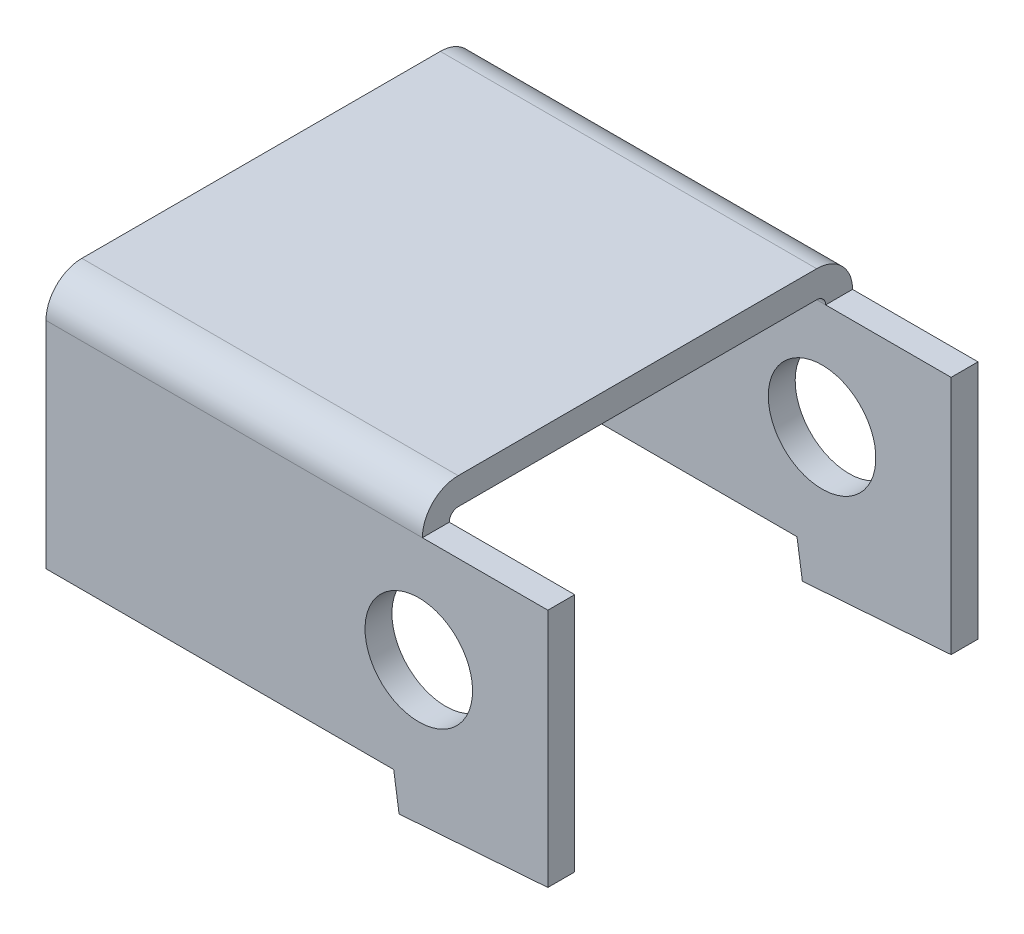
ISO-10303-21;
HEADER;
FILE_DESCRIPTION(('STEP AP214'),'2;1');
FILE_NAME('part.step','',(''),(''),'','','');
FILE_SCHEMA(('AUTOMOTIVE_DESIGN { 1 0 10303 214 1 1 1 1 }'));
ENDSEC;
DATA;
#1=APPLICATION_CONTEXT('core data for automotive mechanical design processes');
#2=APPLICATION_PROTOCOL_DEFINITION('international standard','automotive_design',2000,#1);
#3=PRODUCT_CONTEXT('',#1,'mechanical');
#4=PRODUCT('Part','Part','',(#3));
#5=PRODUCT_RELATED_PRODUCT_CATEGORY('part','',(#4));
#6=PRODUCT_DEFINITION_FORMATION('','',#4);
#7=PRODUCT_DEFINITION_CONTEXT('part definition',#1,'design');
#8=PRODUCT_DEFINITION('design','',#6,#7);
#9=PRODUCT_DEFINITION_SHAPE('','',#8);
#10=(LENGTH_UNIT() NAMED_UNIT(*) SI_UNIT(.MILLI.,.METRE.));
#11=(NAMED_UNIT(*) PLANE_ANGLE_UNIT() SI_UNIT($,.RADIAN.));
#12=(NAMED_UNIT(*) SI_UNIT($,.STERADIAN.) SOLID_ANGLE_UNIT());
#13=UNCERTAINTY_MEASURE_WITH_UNIT(LENGTH_MEASURE(1.E-05),#10,'distance_accuracy_value','');
#14=(GEOMETRIC_REPRESENTATION_CONTEXT(3) GLOBAL_UNCERTAINTY_ASSIGNED_CONTEXT((#13)) GLOBAL_UNIT_ASSIGNED_CONTEXT((#10,
#11,#12)) REPRESENTATION_CONTEXT('',''));
#15=CARTESIAN_POINT('',(0.,0.,0.));
#16=DIRECTION('',(0.,0.,1.));
#17=DIRECTION('',(1.,0.,0.));
#18=AXIS2_PLACEMENT_3D('',#15,#16,#17);
#19=CARTESIAN_POINT('',(3.6,-3.7,6.));
#20=DIRECTION('',(-1.,0.,0.));
#21=DIRECTION('',(0.,0.,1.));
#22=AXIS2_PLACEMENT_3D('',#19,#20,#21);
#23=PLANE('',#22);
#24=DIRECTION('',(0.,1.,0.));
#25=VECTOR('',#24,1.);
#26=CARTESIAN_POINT('',(3.6,-3.7,-6.));
#27=LINE('',#26,#25);
#28=CARTESIAN_POINT('',(3.6,-3.7,-6.));
#29=VERTEX_POINT('',#28);
#30=CARTESIAN_POINT('',(3.600006,3.,-6.));
#31=VERTEX_POINT('',#30);
#32=EDGE_CURVE('E209',#29,#31,#27,.T.);
#33=ORIENTED_EDGE('',*,*,#32,.T.);
#34=DIRECTION('',(0.,0.,1.));
#35=VECTOR('',#34,1.);
#36=CARTESIAN_POINT('',(3.6,3.,6.));
#37=LINE('',#36,#35);
#38=CARTESIAN_POINT('',(3.6,3.,-5.25));
#39=VERTEX_POINT('',#38);
#40=EDGE_CURVE('E280',#31,#39,#37,.T.);
#41=ORIENTED_EDGE('',*,*,#40,.T.);
#42=DIRECTION('',(0.,1.,0.));
#43=VECTOR('',#42,1.);
#44=CARTESIAN_POINT('',(3.6,-4.,-5.25));
#45=LINE('',#44,#43);
#46=CARTESIAN_POINT('',(3.6,-3.7,-5.25));
#47=VERTEX_POINT('',#46);
#48=EDGE_CURVE('E294',#47,#39,#45,.T.);
#49=ORIENTED_EDGE('',*,*,#48,.F.);
#50=DIRECTION('',(0.,0.,-1.));
#51=VECTOR('',#50,1.);
#52=CARTESIAN_POINT('',(3.6,-3.7,6.));
#53=LINE('',#52,#51);
#54=EDGE_CURVE('E238',#47,#29,#53,.T.);
#55=ORIENTED_EDGE('',*,*,#54,.T.);
#56=EDGE_LOOP('',(#33,#41,#49,#55));
#57=FACE_BOUND('',#56,.T.);
#58=ADVANCED_FACE('F39',(#57),#23,.F.);
#59=CARTESIAN_POINT('',(-10.4,4.,6.));
#60=DIRECTION('',(0.,-1.,0.));
#61=DIRECTION('',(0.,0.,-1.));
#62=AXIS2_PLACEMENT_3D('',#59,#60,#61);
#63=PLANE('',#62);
#64=DIRECTION('',(0.,0.,1.));
#65=VECTOR('',#64,1.);
#66=CARTESIAN_POINT('',(0.0999999999999998,4.,5.));
#67=LINE('',#66,#65);
#68=CARTESIAN_POINT('',(0.0999999999999998,4.,-5.));
#69=VERTEX_POINT('',#68);
#70=CARTESIAN_POINT('',(0.0999999999999998,4.,5.));
#71=VERTEX_POINT('',#70);
#72=EDGE_CURVE('E166',#69,#71,#67,.T.);
#73=ORIENTED_EDGE('',*,*,#72,.F.);
#74=DIRECTION('',(-1.,0.,0.));
#75=VECTOR('',#74,1.);
#76=CARTESIAN_POINT('',(-10.4,4.,-5.));
#77=LINE('',#76,#75);
#78=CARTESIAN_POINT('',(-10.4,4.,-5.));
#79=VERTEX_POINT('',#78);
#80=EDGE_CURVE('E180',#69,#79,#77,.T.);
#81=ORIENTED_EDGE('',*,*,#80,.T.);
#82=DIRECTION('',(0.,0.,-1.));
#83=VECTOR('',#82,1.);
#84=CARTESIAN_POINT('',(-10.4,4.,6.));
#85=LINE('',#84,#83);
#86=CARTESIAN_POINT('',(-10.4,4.,5.));
#87=VERTEX_POINT('',#86);
#88=EDGE_CURVE('E192',#87,#79,#85,.T.);
#89=ORIENTED_EDGE('',*,*,#88,.F.);
#90=DIRECTION('',(-1.,0.,0.));
#91=VECTOR('',#90,1.);
#92=CARTESIAN_POINT('',(-10.4,4.,5.));
#93=LINE('',#92,#91);
#94=EDGE_CURVE('E183',#87,#71,#93,.F.);
#95=ORIENTED_EDGE('',*,*,#94,.T.);
#96=EDGE_LOOP('',(#73,#81,#89,#95));
#97=FACE_BOUND('',#96,.T.);
#98=ADVANCED_FACE('F178',(#97),#63,.F.);
#99=CARTESIAN_POINT('',(-10.4,3.,-5.));
#100=DIRECTION('',(1.,0.,0.));
#101=DIRECTION('',(0.,0.,-1.));
#102=AXIS2_PLACEMENT_3D('',#99,#100,#101);
#103=CYLINDRICAL_SURFACE('',#102,1.);
#104=ORIENTED_EDGE('',*,*,#80,.F.);
#105=CARTESIAN_POINT('',(0.0999999999999998,3.,-5.));
#106=DIRECTION('',(1.,0.,0.));
#107=DIRECTION('',(0.,0.,-1.));
#108=AXIS2_PLACEMENT_3D('',#105,#106,#107);
#109=CIRCLE('',#108,1.);
#110=CARTESIAN_POINT('',(0.0999999999999998,3.,-6.));
#111=VERTEX_POINT('',#110);
#112=EDGE_CURVE('E163',#111,#69,#109,.T.);
#113=ORIENTED_EDGE('',*,*,#112,.F.);
#114=DIRECTION('',(-1.,0.,0.));
#115=VECTOR('',#114,1.);
#116=CARTESIAN_POINT('',(3.6,3.,-6.));
#117=LINE('',#116,#115);
#118=CARTESIAN_POINT('',(-10.4,3.,-6.));
#119=VERTEX_POINT('',#118);
#120=EDGE_CURVE('E197',#119,#111,#117,.F.);
#121=ORIENTED_EDGE('',*,*,#120,.F.);
#122=CARTESIAN_POINT('',(-10.4,3.,-5.));
#123=DIRECTION('',(1.,0.,0.));
#124=DIRECTION('',(0.,0.,-1.));
#125=AXIS2_PLACEMENT_3D('',#122,#123,#124);
#126=CIRCLE('',#125,1.);
#127=EDGE_CURVE('E187',#79,#119,#126,.F.);
#128=ORIENTED_EDGE('',*,*,#127,.F.);
#129=EDGE_LOOP('',(#104,#113,#121,#128));
#130=FACE_BOUND('',#129,.T.);
#131=ADVANCED_FACE('F186',(#130),#103,.T.);
#132=CARTESIAN_POINT('',(0.,3.,5.));
#133=DIRECTION('',(-1.,0.,0.));
#134=DIRECTION('',(0.,0.,1.));
#135=AXIS2_PLACEMENT_3D('',#132,#133,#134);
#136=CYLINDRICAL_SURFACE('',#135,1.);
#137=DIRECTION('',(-1.,0.,0.));
#138=VECTOR('',#137,1.);
#139=CARTESIAN_POINT('',(0.,3.,6.));
#140=LINE('',#139,#138);
#141=CARTESIAN_POINT('',(0.0999999999999998,3.,6.));
#142=VERTEX_POINT('',#141);
#143=CARTESIAN_POINT('',(-10.4,3.,6.));
#144=VERTEX_POINT('',#143);
#145=EDGE_CURVE('E199',#142,#144,#140,.T.);
#146=ORIENTED_EDGE('',*,*,#145,.F.);
#147=CARTESIAN_POINT('',(0.0999999999999998,3.,5.));
#148=DIRECTION('',(1.,0.,0.));
#149=DIRECTION('',(0.,0.,-1.));
#150=AXIS2_PLACEMENT_3D('',#147,#148,#149);
#151=CIRCLE('',#150,1.);
#152=EDGE_CURVE('E184',#71,#142,#151,.T.);
#153=ORIENTED_EDGE('',*,*,#152,.F.);
#154=ORIENTED_EDGE('',*,*,#94,.F.);
#155=CARTESIAN_POINT('',(-10.4,3.,5.));
#156=DIRECTION('',(1.,0.,0.));
#157=DIRECTION('',(0.,0.,-1.));
#158=AXIS2_PLACEMENT_3D('',#155,#156,#157);
#159=CIRCLE('',#158,1.);
#160=EDGE_CURVE('E189',#144,#87,#159,.F.);
#161=ORIENTED_EDGE('',*,*,#160,.F.);
#162=EDGE_LOOP('',(#146,#153,#154,#161));
#163=FACE_BOUND('',#162,.T.);
#164=ADVANCED_FACE('F41',(#163),#136,.T.);
#165=CARTESIAN_POINT('',(-10.4,3.,5.));
#166=DIRECTION('',(1.,0.,0.));
#167=DIRECTION('',(0.,0.,-1.));
#168=AXIS2_PLACEMENT_3D('',#165,#166,#167);
#169=CYLINDRICAL_SURFACE('',#168,0.25);
#170=CARTESIAN_POINT('',(0.0999999999999994,3.,5.));
#171=DIRECTION('',(1.,0.,0.));
#172=DIRECTION('',(0.,0.,-1.));
#173=AXIS2_PLACEMENT_3D('',#170,#171,#172);
#174=CIRCLE('',#173,0.25);
#175=CARTESIAN_POINT('',(0.0999999999999994,3.,5.25));
#176=VERTEX_POINT('',#175);
#177=CARTESIAN_POINT('',(0.0999999999999994,3.25,5.));
#178=VERTEX_POINT('',#177);
#179=EDGE_CURVE('E278',#176,#178,#174,.F.);
#180=ORIENTED_EDGE('',*,*,#179,.F.);
#181=DIRECTION('',(1.,0.,0.));
#182=VECTOR('',#181,1.);
#183=CARTESIAN_POINT('',(-10.4,3.,5.25));
#184=LINE('',#183,#182);
#185=CARTESIAN_POINT('',(-10.4,3.,5.25));
#186=VERTEX_POINT('',#185);
#187=EDGE_CURVE('E314',#186,#176,#184,.T.);
#188=ORIENTED_EDGE('',*,*,#187,.F.);
#189=CARTESIAN_POINT('',(-10.4,3.,5.));
#190=DIRECTION('',(1.,0.,0.));
#191=DIRECTION('',(0.,0.,-1.));
#192=AXIS2_PLACEMENT_3D('',#189,#190,#191);
#193=CIRCLE('',#192,0.25);
#194=CARTESIAN_POINT('',(-10.4,3.25,5.));
#195=VERTEX_POINT('',#194);
#196=EDGE_CURVE('E308',#195,#186,#193,.T.);
#197=ORIENTED_EDGE('',*,*,#196,.F.);
#198=DIRECTION('',(1.,0.,0.));
#199=VECTOR('',#198,1.);
#200=CARTESIAN_POINT('',(-10.4,3.25,5.));
#201=LINE('',#200,#199);
#202=EDGE_CURVE('E317',#195,#178,#201,.T.);
#203=ORIENTED_EDGE('',*,*,#202,.T.);
#204=EDGE_LOOP('',(#180,#188,#197,#203));
#205=FACE_BOUND('',#204,.T.);
#206=ADVANCED_FACE('F361',(#205),#169,.F.);
#207=CARTESIAN_POINT('',(-10.4,3.25,-5.));
#208=DIRECTION('',(0.,1.,0.));
#209=DIRECTION('',(0.,0.,1.));
#210=AXIS2_PLACEMENT_3D('',#207,#208,#209);
#211=PLANE('',#210);
#212=DIRECTION('',(0.,0.,-1.));
#213=VECTOR('',#212,1.);
#214=CARTESIAN_POINT('',(0.0999999999999994,3.25,-5.));
#215=LINE('',#214,#213);
#216=CARTESIAN_POINT('',(0.0999999999999994,3.25,-5.));
#217=VERTEX_POINT('',#216);
#218=EDGE_CURVE('E55',#178,#217,#215,.T.);
#219=ORIENTED_EDGE('',*,*,#218,.F.);
#220=ORIENTED_EDGE('',*,*,#202,.F.);
#221=DIRECTION('',(0.,0.,1.));
#222=VECTOR('',#221,1.);
#223=CARTESIAN_POINT('',(-10.4,3.25,-5.));
#224=LINE('',#223,#222);
#225=CARTESIAN_POINT('',(-10.4,3.25,-5.));
#226=VERTEX_POINT('',#225);
#227=EDGE_CURVE('E305',#226,#195,#224,.T.);
#228=ORIENTED_EDGE('',*,*,#227,.F.);
#229=DIRECTION('',(1.,0.,0.));
#230=VECTOR('',#229,1.);
#231=CARTESIAN_POINT('',(-10.4,3.25,-5.));
#232=LINE('',#231,#230);
#233=EDGE_CURVE('E320',#226,#217,#232,.T.);
#234=ORIENTED_EDGE('',*,*,#233,.T.);
#235=EDGE_LOOP('',(#219,#220,#228,#234));
#236=FACE_BOUND('',#235,.T.);
#237=ADVANCED_FACE('F363',(#236),#211,.F.);
#238=CARTESIAN_POINT('',(-10.4,3.,-5.));
#239=DIRECTION('',(1.,0.,0.));
#240=DIRECTION('',(0.,0.,-1.));
#241=AXIS2_PLACEMENT_3D('',#238,#239,#240);
#242=CYLINDRICAL_SURFACE('',#241,0.25);
#243=CARTESIAN_POINT('',(0.0999999999999994,3.,-5.));
#244=DIRECTION('',(1.,0.,0.));
#245=DIRECTION('',(0.,0.,-1.));
#246=AXIS2_PLACEMENT_3D('',#243,#244,#245);
#247=CIRCLE('',#246,0.25);
#248=CARTESIAN_POINT('',(0.0999999999999994,3.,-5.25));
#249=VERTEX_POINT('',#248);
#250=EDGE_CURVE('E11',#217,#249,#247,.F.);
#251=ORIENTED_EDGE('',*,*,#250,.F.);
#252=ORIENTED_EDGE('',*,*,#233,.F.);
#253=CARTESIAN_POINT('',(-10.4,3.,-5.));
#254=DIRECTION('',(1.,0.,0.));
#255=DIRECTION('',(0.,0.,-1.));
#256=AXIS2_PLACEMENT_3D('',#253,#254,#255);
#257=CIRCLE('',#256,0.25);
#258=CARTESIAN_POINT('',(-10.4,3.,-5.25));
#259=VERTEX_POINT('',#258);
#260=EDGE_CURVE('E302',#259,#226,#257,.T.);
#261=ORIENTED_EDGE('',*,*,#260,.F.);
#262=DIRECTION('',(1.,0.,0.));
#263=VECTOR('',#262,1.);
#264=CARTESIAN_POINT('',(-10.4,3.,-5.25));
#265=LINE('',#264,#263);
#266=EDGE_CURVE('E323',#259,#249,#265,.T.);
#267=ORIENTED_EDGE('',*,*,#266,.T.);
#268=EDGE_LOOP('',(#251,#252,#261,#267));
#269=FACE_BOUND('',#268,.T.);
#270=ADVANCED_FACE('F367',(#269),#242,.F.);
#271=CARTESIAN_POINT('',(-10.4,-3.,6.));
#272=DIRECTION('',(0.,1.,0.));
#273=DIRECTION('',(0.,0.,1.));
#274=AXIS2_PLACEMENT_3D('',#271,#272,#273);
#275=PLANE('',#274);
#276=DIRECTION('',(0.,0.,-1.));
#277=VECTOR('',#276,1.);
#278=CARTESIAN_POINT('',(-10.4,-3.,6.));
#279=LINE('',#278,#277);
#280=CARTESIAN_POINT('',(-10.4,-3.,6.));
#281=VERTEX_POINT('',#280);
#282=CARTESIAN_POINT('',(-10.4,-3.,5.25));
#283=VERTEX_POINT('',#282);
#284=EDGE_CURVE('E260',#281,#283,#279,.T.);
#285=ORIENTED_EDGE('',*,*,#284,.T.);
#286=DIRECTION('',(1.,0.,0.));
#287=VECTOR('',#286,1.);
#288=CARTESIAN_POINT('',(-10.4,-3.,5.25));
#289=LINE('',#288,#287);
#290=CARTESIAN_POINT('',(-0.7,-3.,5.25));
#291=VERTEX_POINT('',#290);
#292=EDGE_CURVE('E225',#283,#291,#289,.T.);
#293=ORIENTED_EDGE('',*,*,#292,.T.);
#294=DIRECTION('',(0.,0.,-1.));
#295=VECTOR('',#294,1.);
#296=CARTESIAN_POINT('',(-0.7,-3.,6.));
#297=LINE('',#296,#295);
#298=CARTESIAN_POINT('',(-0.7,-3.,6.));
#299=VERTEX_POINT('',#298);
#300=EDGE_CURVE('E256',#299,#291,#297,.T.);
#301=ORIENTED_EDGE('',*,*,#300,.F.);
#302=DIRECTION('',(1.,0.,0.));
#303=VECTOR('',#302,1.);
#304=CARTESIAN_POINT('',(-10.4,-3.,6.));
#305=LINE('',#304,#303);
#306=EDGE_CURVE('E232',#281,#299,#305,.T.);
#307=ORIENTED_EDGE('',*,*,#306,.F.);
#308=EDGE_LOOP('',(#285,#293,#301,#307));
#309=FACE_BOUND('',#308,.T.);
#310=ADVANCED_FACE('F342',(#309),#275,.F.);
#311=CARTESIAN_POINT('',(-0.7,-3.,6.));
#312=DIRECTION('',(0.988936352868297,0.148340452930245,0.));
#313=DIRECTION('',(-0.148340452930245,0.988936352868298,0.));
#314=AXIS2_PLACEMENT_3D('',#311,#312,#313);
#315=PLANE('',#314);
#316=ORIENTED_EDGE('',*,*,#300,.T.);
#317=DIRECTION('',(0.148340452930245,-0.988936352868298,0.));
#318=VECTOR('',#317,1.);
#319=CARTESIAN_POINT('',(-0.7,-3.,5.25));
#320=LINE('',#319,#318);
#321=CARTESIAN_POINT('',(-0.55000000000023,-4.00000000000001,5.25));
#322=VERTEX_POINT('',#321);
#323=EDGE_CURVE('E335',#291,#322,#320,.T.);
#324=ORIENTED_EDGE('',*,*,#323,.T.);
#325=DIRECTION('',(0.,0.,-1.));
#326=VECTOR('',#325,1.);
#327=CARTESIAN_POINT('',(-0.55,-4.,6.));
#328=LINE('',#327,#326);
#329=CARTESIAN_POINT('',(-0.55,-4.,6.));
#330=VERTEX_POINT('',#329);
#331=EDGE_CURVE('E252',#330,#322,#328,.T.);
#332=ORIENTED_EDGE('',*,*,#331,.F.);
#333=DIRECTION('',(0.148340452930245,-0.988936352868298,0.));
#334=VECTOR('',#333,1.);
#335=CARTESIAN_POINT('',(-0.7,-3.,6.));
#336=LINE('',#335,#334);
#337=EDGE_CURVE('E235',#299,#330,#336,.T.);
#338=ORIENTED_EDGE('',*,*,#337,.F.);
#339=EDGE_LOOP('',(#316,#324,#332,#338));
#340=FACE_BOUND('',#339,.T.);
#341=ADVANCED_FACE('F348',(#340),#315,.F.);
#342=CARTESIAN_POINT('',(-0.55,-4.,6.));
#343=DIRECTION('',(-0.0721010121751331,0.997397335089342,0.));
#344=DIRECTION('',(-0.997397335089342,-0.0721010121751332,0.));
#345=AXIS2_PLACEMENT_3D('',#342,#343,#344);
#346=PLANE('',#345);
#347=ORIENTED_EDGE('',*,*,#331,.T.);
#348=DIRECTION('',(0.997397335089342,0.0721010121751332,0.));
#349=VECTOR('',#348,1.);
#350=CARTESIAN_POINT('',(-0.55,-4.,5.25));
#351=LINE('',#350,#349);
#352=CARTESIAN_POINT('',(3.6,-3.7,5.25));
#353=VERTEX_POINT('',#352);
#354=EDGE_CURVE('E333',#322,#353,#351,.T.);
#355=ORIENTED_EDGE('',*,*,#354,.T.);
#356=CARTESIAN_POINT('',(3.6,-3.7,6.));
#357=VERTEX_POINT('',#356);
#358=EDGE_CURVE('E248',#357,#353,#53,.T.);
#359=ORIENTED_EDGE('',*,*,#358,.F.);
#360=DIRECTION('',(0.997397335089342,0.0721010121751332,0.));
#361=VECTOR('',#360,1.);
#362=CARTESIAN_POINT('',(-0.55,-4.,6.));
#363=LINE('',#362,#361);
#364=EDGE_CURVE('E237',#330,#357,#363,.T.);
#365=ORIENTED_EDGE('',*,*,#364,.F.);
#366=EDGE_LOOP('',(#347,#355,#359,#365));
#367=FACE_BOUND('',#366,.T.);
#368=ADVANCED_FACE('F397',(#367),#346,.F.);
#369=CARTESIAN_POINT('',(0.,0.,6.));
#370=DIRECTION('',(0.,0.,-1.));
#371=DIRECTION('',(-1.,0.,0.));
#372=AXIS2_PLACEMENT_3D('',#369,#370,#371);
#373=CYLINDRICAL_SURFACE('',#372,1.5);
#374=CARTESIAN_POINT('',(0.,0.,5.25));
#375=DIRECTION('',(0.,0.,1.));
#376=DIRECTION('',(0.,-1.,0.));
#377=AXIS2_PLACEMENT_3D('',#374,#375,#376);
#378=CIRCLE('',#377,1.5);
#379=CARTESIAN_POINT('',(0.,-1.5,5.25));
#380=VERTEX_POINT('',#379);
#381=EDGE_CURVE('E332',#380,#380,#378,.T.);
#382=ORIENTED_EDGE('',*,*,#381,.F.);
#383=EDGE_LOOP('',(#382));
#384=FACE_BOUND('',#383,.T.);
#385=CARTESIAN_POINT('',(0.,0.,6.));
#386=DIRECTION('',(0.,0.,1.));
#387=DIRECTION('',(1.,0.,0.));
#388=AXIS2_PLACEMENT_3D('',#385,#386,#387);
#389=CIRCLE('',#388,1.5);
#390=CARTESIAN_POINT('',(1.5,0.,6.));
#391=VERTEX_POINT('',#390);
#392=EDGE_CURVE('E212',#391,#391,#389,.T.);
#393=ORIENTED_EDGE('',*,*,#392,.T.);
#394=EDGE_LOOP('',(#393));
#395=FACE_BOUND('',#394,.T.);
#396=ADVANCED_FACE('F423',(#384,#395),#373,.F.);
#397=CARTESIAN_POINT('',(0.,0.,6.));
#398=DIRECTION('',(0.,0.,-1.));
#399=DIRECTION('',(-1.,0.,0.));
#400=AXIS2_PLACEMENT_3D('',#397,#398,#399);
#401=PLANE('',#400);
#402=DIRECTION('',(0.,1.,0.));
#403=VECTOR('',#402,1.);
#404=CARTESIAN_POINT('',(3.6,-3.7,6.));
#405=LINE('',#404,#403);
#406=CARTESIAN_POINT('',(3.600006,3.,6.));
#407=VERTEX_POINT('',#406);
#408=EDGE_CURVE('E233',#357,#407,#405,.T.);
#409=ORIENTED_EDGE('',*,*,#408,.T.);
#410=EDGE_CURVE('E48',#407,#142,#140,.T.);
#411=ORIENTED_EDGE('',*,*,#410,.T.);
#412=ORIENTED_EDGE('',*,*,#145,.T.);
#413=DIRECTION('',(0.,-1.,0.));
#414=VECTOR('',#413,1.);
#415=CARTESIAN_POINT('',(-10.4,-3.,6.));
#416=LINE('',#415,#414);
#417=EDGE_CURVE('E230',#144,#281,#416,.T.);
#418=ORIENTED_EDGE('',*,*,#417,.T.);
#419=ORIENTED_EDGE('',*,*,#306,.T.);
#420=ORIENTED_EDGE('',*,*,#337,.T.);
#421=ORIENTED_EDGE('',*,*,#364,.T.);
#422=EDGE_LOOP('',(#409,#411,#412,#418,#419,#420,#421));
#423=FACE_BOUND('',#422,.T.);
#424=ORIENTED_EDGE('',*,*,#392,.F.);
#425=EDGE_LOOP('',(#424));
#426=FACE_BOUND('',#425,.T.);
#427=ADVANCED_FACE('F352',(#423,#426),#401,.F.);
#428=CARTESIAN_POINT('',(0.,0.,-6.));
#429=DIRECTION('',(0.,0.,-1.));
#430=DIRECTION('',(-1.,0.,0.));
#431=AXIS2_PLACEMENT_3D('',#428,#429,#430);
#432=PLANE('',#431);
#433=DIRECTION('',(0.,-1.,0.));
#434=VECTOR('',#433,1.);
#435=CARTESIAN_POINT('',(-10.4,-3.,-6.));
#436=LINE('',#435,#434);
#437=CARTESIAN_POINT('',(-10.4,-3.,-6.));
#438=VERTEX_POINT('',#437);
#439=EDGE_CURVE('E211',#119,#438,#436,.T.);
#440=ORIENTED_EDGE('',*,*,#439,.F.);
#441=ORIENTED_EDGE('',*,*,#120,.T.);
#442=DIRECTION('',(1.,0.,0.));
#443=VECTOR('',#442,1.);
#444=CARTESIAN_POINT('',(0.0999999999999998,3.,-6.));
#445=LINE('',#444,#443);
#446=EDGE_CURVE('E276',#111,#31,#445,.T.);
#447=ORIENTED_EDGE('',*,*,#446,.T.);
#448=ORIENTED_EDGE('',*,*,#32,.F.);
#449=DIRECTION('',(0.997397335089342,0.0721010121751332,0.));
#450=VECTOR('',#449,1.);
#451=CARTESIAN_POINT('',(-0.55,-4.,-6.));
#452=LINE('',#451,#450);
#453=CARTESIAN_POINT('',(-0.55,-4.,-6.));
#454=VERTEX_POINT('',#453);
#455=EDGE_CURVE('E245',#454,#29,#452,.T.);
#456=ORIENTED_EDGE('',*,*,#455,.F.);
#457=DIRECTION('',(0.148340452930245,-0.988936352868298,0.));
#458=VECTOR('',#457,1.);
#459=CARTESIAN_POINT('',(-0.7,-3.,-6.));
#460=LINE('',#459,#458);
#461=CARTESIAN_POINT('',(-0.7,-3.,-6.));
#462=VERTEX_POINT('',#461);
#463=EDGE_CURVE('E242',#462,#454,#460,.T.);
#464=ORIENTED_EDGE('',*,*,#463,.F.);
#465=DIRECTION('',(1.,0.,0.));
#466=VECTOR('',#465,1.);
#467=CARTESIAN_POINT('',(-10.4,-3.,-6.));
#468=LINE('',#467,#466);
#469=EDGE_CURVE('E217',#438,#462,#468,.T.);
#470=ORIENTED_EDGE('',*,*,#469,.F.);
#471=EDGE_LOOP('',(#440,#441,#447,#448,#456,#464,#470));
#472=FACE_BOUND('',#471,.T.);
#473=CARTESIAN_POINT('',(0.,0.,-6.));
#474=DIRECTION('',(0.,0.,1.));
#475=DIRECTION('',(1.,0.,0.));
#476=AXIS2_PLACEMENT_3D('',#473,#474,#475);
#477=CIRCLE('',#476,1.5);
#478=CARTESIAN_POINT('',(1.5,0.,-6.));
#479=VERTEX_POINT('',#478);
#480=EDGE_CURVE('E220',#479,#479,#477,.T.);
#481=ORIENTED_EDGE('',*,*,#480,.T.);
#482=EDGE_LOOP('',(#481));
#483=FACE_BOUND('',#482,.T.);
#484=ADVANCED_FACE('F380',(#472,#483),#432,.T.);
#485=DIRECTION('',(0.,-1.,0.));
#486=VECTOR('',#485,1.);
#487=CARTESIAN_POINT('',(3.6,3.,5.25));
#488=LINE('',#487,#486);
#489=CARTESIAN_POINT('',(3.6,3.,5.25));
#490=VERTEX_POINT('',#489);
#491=EDGE_CURVE('E297',#490,#353,#488,.T.);
#492=ORIENTED_EDGE('',*,*,#491,.F.);
#493=EDGE_CURVE('E291',#490,#407,#37,.T.);
#494=ORIENTED_EDGE('',*,*,#493,.T.);
#495=ORIENTED_EDGE('',*,*,#408,.F.);
#496=ORIENTED_EDGE('',*,*,#358,.T.);
#497=EDGE_LOOP('',(#492,#494,#495,#496));
#498=FACE_BOUND('',#497,.T.);
#499=ADVANCED_FACE('F402',(#498),#23,.F.);
#500=CARTESIAN_POINT('',(-10.4,-3.,6.));
#501=DIRECTION('',(1.,0.,0.));
#502=DIRECTION('',(0.,0.,-1.));
#503=AXIS2_PLACEMENT_3D('',#500,#501,#502);
#504=PLANE('',#503);
#505=ORIENTED_EDGE('',*,*,#196,.T.);
#506=DIRECTION('',(0.,-1.,0.));
#507=VECTOR('',#506,1.);
#508=CARTESIAN_POINT('',(-10.4,3.,5.25));
#509=LINE('',#508,#507);
#510=EDGE_CURVE('E310',#186,#283,#509,.T.);
#511=ORIENTED_EDGE('',*,*,#510,.T.);
#512=ORIENTED_EDGE('',*,*,#284,.F.);
#513=ORIENTED_EDGE('',*,*,#417,.F.);
#514=ORIENTED_EDGE('',*,*,#160,.T.);
#515=ORIENTED_EDGE('',*,*,#88,.T.);
#516=ORIENTED_EDGE('',*,*,#127,.T.);
#517=ORIENTED_EDGE('',*,*,#439,.T.);
#518=CARTESIAN_POINT('',(-10.4,-3.,-5.25));
#519=VERTEX_POINT('',#518);
#520=EDGE_CURVE('E259',#519,#438,#279,.T.);
#521=ORIENTED_EDGE('',*,*,#520,.F.);
#522=DIRECTION('',(0.,1.,0.));
#523=VECTOR('',#522,1.);
#524=CARTESIAN_POINT('',(-10.4,-4.,-5.25));
#525=LINE('',#524,#523);
#526=EDGE_CURVE('E299',#519,#259,#525,.T.);
#527=ORIENTED_EDGE('',*,*,#526,.T.);
#528=ORIENTED_EDGE('',*,*,#260,.T.);
#529=ORIENTED_EDGE('',*,*,#227,.T.);
#530=EDGE_LOOP('',(#505,#511,#512,#513,#514,#515,#516,#517,#521,#527,#528,#529));
#531=FACE_BOUND('',#530,.T.);
#532=ADVANCED_FACE('F264',(#531),#504,.F.);
#533=CARTESIAN_POINT('',(-0.7,-3.,-5.25));
#534=VERTEX_POINT('',#533);
#535=EDGE_CURVE('E255',#534,#462,#297,.T.);
#536=ORIENTED_EDGE('',*,*,#535,.F.);
#537=DIRECTION('',(-1.,0.,0.));
#538=VECTOR('',#537,1.);
#539=CARTESIAN_POINT('',(-10.4,-3.,-5.25));
#540=LINE('',#539,#538);
#541=EDGE_CURVE('E329',#534,#519,#540,.T.);
#542=ORIENTED_EDGE('',*,*,#541,.T.);
#543=ORIENTED_EDGE('',*,*,#520,.T.);
#544=ORIENTED_EDGE('',*,*,#469,.T.);
#545=EDGE_LOOP('',(#536,#542,#543,#544));
#546=FACE_BOUND('',#545,.T.);
#547=ADVANCED_FACE('F386',(#546),#275,.F.);
#548=CARTESIAN_POINT('',(-0.55,-4.,-5.25));
#549=VERTEX_POINT('',#548);
#550=EDGE_CURVE('E251',#549,#454,#328,.T.);
#551=ORIENTED_EDGE('',*,*,#550,.F.);
#552=DIRECTION('',(-0.148340452930245,0.988936352868298,0.));
#553=VECTOR('',#552,1.);
#554=CARTESIAN_POINT('',(-0.7,-3.,-5.25));
#555=LINE('',#554,#553);
#556=EDGE_CURVE('E63',#549,#534,#555,.T.);
#557=ORIENTED_EDGE('',*,*,#556,.T.);
#558=ORIENTED_EDGE('',*,*,#535,.T.);
#559=ORIENTED_EDGE('',*,*,#463,.T.);
#560=EDGE_LOOP('',(#551,#557,#558,#559));
#561=FACE_BOUND('',#560,.T.);
#562=ADVANCED_FACE('F388',(#561),#315,.F.);
#563=ORIENTED_EDGE('',*,*,#54,.F.);
#564=DIRECTION('',(-0.997397335089342,-0.0721010121751332,0.));
#565=VECTOR('',#564,1.);
#566=CARTESIAN_POINT('',(-0.55,-4.,-5.25));
#567=LINE('',#566,#565);
#568=EDGE_CURVE('E326',#47,#549,#567,.T.);
#569=ORIENTED_EDGE('',*,*,#568,.T.);
#570=ORIENTED_EDGE('',*,*,#550,.T.);
#571=ORIENTED_EDGE('',*,*,#455,.T.);
#572=EDGE_LOOP('',(#563,#569,#570,#571));
#573=FACE_BOUND('',#572,.T.);
#574=ADVANCED_FACE('F375',(#573),#346,.F.);
#575=CARTESIAN_POINT('',(0.,0.,-5.25));
#576=DIRECTION('',(0.,0.,-1.));
#577=DIRECTION('',(-1.,0.,0.));
#578=AXIS2_PLACEMENT_3D('',#575,#576,#577);
#579=CIRCLE('',#578,1.5);
#580=CARTESIAN_POINT('',(-1.5,0.,-5.25));
#581=VERTEX_POINT('',#580);
#582=EDGE_CURVE('E202',#581,#581,#579,.T.);
#583=ORIENTED_EDGE('',*,*,#582,.F.);
#584=EDGE_LOOP('',(#583));
#585=FACE_BOUND('',#584,.T.);
#586=ORIENTED_EDGE('',*,*,#480,.F.);
#587=EDGE_LOOP('',(#586));
#588=FACE_BOUND('',#587,.T.);
#589=ADVANCED_FACE('F395',(#585,#588),#373,.F.);
#590=CARTESIAN_POINT('',(-10.4,3.,5.25));
#591=DIRECTION('',(0.,0.,1.));
#592=DIRECTION('',(0.,-1.,0.));
#593=AXIS2_PLACEMENT_3D('',#590,#591,#592);
#594=PLANE('',#593);
#595=ORIENTED_EDGE('',*,*,#381,.T.);
#596=EDGE_LOOP('',(#595));
#597=FACE_BOUND('',#596,.T.);
#598=ORIENTED_EDGE('',*,*,#510,.F.);
#599=ORIENTED_EDGE('',*,*,#187,.T.);
#600=DIRECTION('',(1.,0.,0.));
#601=VECTOR('',#600,1.);
#602=CARTESIAN_POINT('',(-10.4,3.,5.25));
#603=LINE('',#602,#601);
#604=EDGE_CURVE('E286',#176,#490,#603,.T.);
#605=ORIENTED_EDGE('',*,*,#604,.T.);
#606=ORIENTED_EDGE('',*,*,#491,.T.);
#607=ORIENTED_EDGE('',*,*,#354,.F.);
#608=ORIENTED_EDGE('',*,*,#323,.F.);
#609=ORIENTED_EDGE('',*,*,#292,.F.);
#610=EDGE_LOOP('',(#598,#599,#605,#606,#607,#608,#609));
#611=FACE_BOUND('',#610,.T.);
#612=ADVANCED_FACE('F356',(#597,#611),#594,.F.);
#613=CARTESIAN_POINT('',(-10.4,-4.,-5.25));
#614=DIRECTION('',(0.,0.,-1.));
#615=DIRECTION('',(-1.,0.,0.));
#616=AXIS2_PLACEMENT_3D('',#613,#614,#615);
#617=PLANE('',#616);
#618=ORIENTED_EDGE('',*,*,#582,.T.);
#619=EDGE_LOOP('',(#618));
#620=FACE_BOUND('',#619,.T.);
#621=ORIENTED_EDGE('',*,*,#556,.F.);
#622=ORIENTED_EDGE('',*,*,#568,.F.);
#623=ORIENTED_EDGE('',*,*,#48,.T.);
#624=EDGE_CURVE('E313',#249,#39,#265,.T.);
#625=ORIENTED_EDGE('',*,*,#624,.F.);
#626=ORIENTED_EDGE('',*,*,#266,.F.);
#627=ORIENTED_EDGE('',*,*,#526,.F.);
#628=ORIENTED_EDGE('',*,*,#541,.F.);
#629=EDGE_LOOP('',(#621,#622,#623,#625,#626,#627,#628));
#630=FACE_BOUND('',#629,.T.);
#631=ADVANCED_FACE('F371',(#620,#630),#617,.F.);
#632=CARTESIAN_POINT('',(0.0999999999999998,3.,6.));
#633=DIRECTION('',(0.,-1.,0.));
#634=DIRECTION('',(0.,0.,-1.));
#635=AXIS2_PLACEMENT_3D('',#632,#633,#634);
#636=PLANE('',#635);
#637=ORIENTED_EDGE('',*,*,#604,.F.);
#638=DIRECTION('',(0.,0.,-1.));
#639=VECTOR('',#638,1.);
#640=CARTESIAN_POINT('',(0.0999999999999998,3.,6.));
#641=LINE('',#640,#639);
#642=EDGE_CURVE('E273',#142,#176,#641,.T.);
#643=ORIENTED_EDGE('',*,*,#642,.F.);
#644=ORIENTED_EDGE('',*,*,#410,.F.);
#645=ORIENTED_EDGE('',*,*,#493,.F.);
#646=EDGE_LOOP('',(#637,#643,#644,#645));
#647=FACE_BOUND('',#646,.T.);
#648=ADVANCED_FACE('F442',(#647),#636,.F.);
#649=ORIENTED_EDGE('',*,*,#446,.F.);
#650=EDGE_CURVE('E169',#249,#111,#641,.T.);
#651=ORIENTED_EDGE('',*,*,#650,.F.);
#652=ORIENTED_EDGE('',*,*,#624,.T.);
#653=ORIENTED_EDGE('',*,*,#40,.F.);
#654=EDGE_LOOP('',(#649,#651,#652,#653));
#655=FACE_BOUND('',#654,.T.);
#656=ADVANCED_FACE('F370',(#655),#636,.F.);
#657=CARTESIAN_POINT('',(0.0999999999999998,3.,-5.));
#658=DIRECTION('',(1.,0.,0.));
#659=DIRECTION('',(0.,0.,-1.));
#660=AXIS2_PLACEMENT_3D('',#657,#658,#659);
#661=PLANE('',#660);
#662=ORIENTED_EDGE('',*,*,#179,.T.);
#663=ORIENTED_EDGE('',*,*,#218,.T.);
#664=ORIENTED_EDGE('',*,*,#250,.T.);
#665=ORIENTED_EDGE('',*,*,#650,.T.);
#666=ORIENTED_EDGE('',*,*,#112,.T.);
#667=ORIENTED_EDGE('',*,*,#72,.T.);
#668=ORIENTED_EDGE('',*,*,#152,.T.);
#669=ORIENTED_EDGE('',*,*,#642,.T.);
#670=EDGE_LOOP('',(#662,#663,#664,#665,#666,#667,#668,#669));
#671=FACE_BOUND('',#670,.T.);
#672=ADVANCED_FACE('F165',(#671),#661,.T.);
#673=CLOSED_SHELL('',(#58,#98,#131,#164,#206,#237,#270,#310,#341,#368,#396,#427,#484,#499,#532,
#547,#562,#574,#589,#612,#631,#648,#656,#672));
#674=MANIFOLD_SOLID_BREP('B2',#673);
#675=ADVANCED_BREP_SHAPE_REPRESENTATION('',(#18,#674),#14);
#676=SHAPE_DEFINITION_REPRESENTATION(#9,#675);
ENDSEC;
END-ISO-10303-21;
